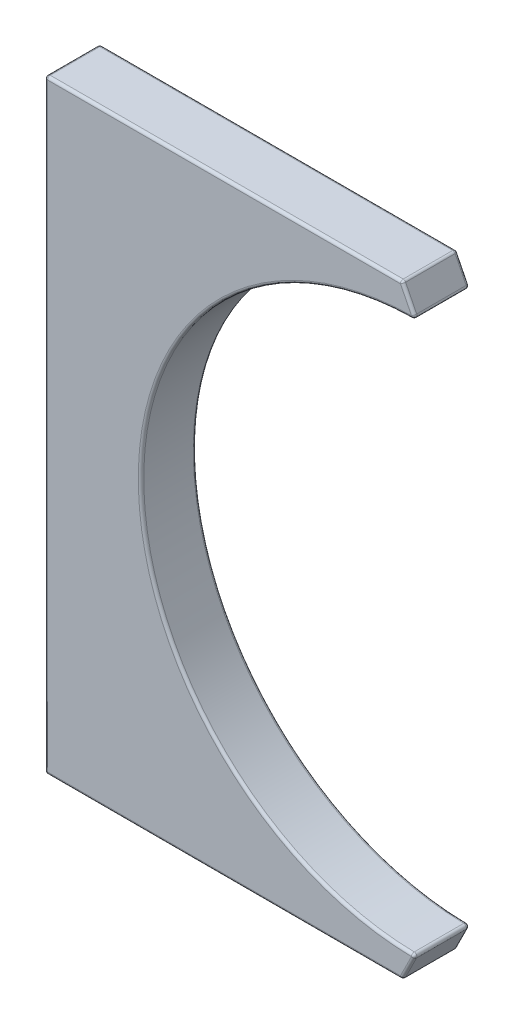
ISO-10303-21;
HEADER;
FILE_DESCRIPTION(('STEP AP214'),'2;1');
FILE_NAME('part.step','',(''),(''),'','','');
FILE_SCHEMA(('AUTOMOTIVE_DESIGN { 1 0 10303 214 1 1 1 1 }'));
ENDSEC;
DATA;
#1=APPLICATION_CONTEXT('core data for automotive mechanical design processes');
#2=APPLICATION_PROTOCOL_DEFINITION('international standard','automotive_design',2000,#1);
#3=PRODUCT_CONTEXT('',#1,'mechanical');
#4=PRODUCT('Part','Part','',(#3));
#5=PRODUCT_RELATED_PRODUCT_CATEGORY('part','',(#4));
#6=PRODUCT_DEFINITION_FORMATION('','',#4);
#7=PRODUCT_DEFINITION_CONTEXT('part definition',#1,'design');
#8=PRODUCT_DEFINITION('design','',#6,#7);
#9=PRODUCT_DEFINITION_SHAPE('','',#8);
#10=(LENGTH_UNIT() NAMED_UNIT(*) SI_UNIT(.MILLI.,.METRE.));
#11=(NAMED_UNIT(*) PLANE_ANGLE_UNIT() SI_UNIT($,.RADIAN.));
#12=(NAMED_UNIT(*) SI_UNIT($,.STERADIAN.) SOLID_ANGLE_UNIT());
#13=UNCERTAINTY_MEASURE_WITH_UNIT(LENGTH_MEASURE(1.E-05),#10,'distance_accuracy_value','');
#14=(GEOMETRIC_REPRESENTATION_CONTEXT(3) GLOBAL_UNCERTAINTY_ASSIGNED_CONTEXT((#13)) GLOBAL_UNIT_ASSIGNED_CONTEXT((#10,
#11,#12)) REPRESENTATION_CONTEXT('',''));
#15=CARTESIAN_POINT('',(0.,0.,0.));
#16=DIRECTION('',(0.,0.,1.));
#17=DIRECTION('',(1.,0.,0.));
#18=AXIS2_PLACEMENT_3D('',#15,#16,#17);
#19=CARTESIAN_POINT('',(0.,105.351887555812,20.));
#20=DIRECTION('',(0.,-1.,0.));
#21=DIRECTION('',(0.,0.,-1.));
#22=AXIS2_PLACEMENT_3D('',#19,#20,#21);
#23=PLANE('',#22);
#24=DIRECTION('',(-1.,0.,0.));
#25=VECTOR('',#24,1.);
#26=CARTESIAN_POINT('',(130.,105.351887555812,19.));
#27=LINE('',#26,#25);
#28=CARTESIAN_POINT('',(1.00000000000003,105.351887555812,19.));
#29=VERTEX_POINT('',#28);
#30=CARTESIAN_POINT('',(129.38196601125,105.351887555812,19.));
#31=VERTEX_POINT('',#30);
#32=EDGE_CURVE('E50',#29,#31,#27,.F.);
#33=ORIENTED_EDGE('',*,*,#32,.T.);
#34=DIRECTION('',(0.,0.,-1.));
#35=VECTOR('',#34,1.);
#36=CARTESIAN_POINT('',(129.38196601125,105.351887555812,20.));
#37=LINE('',#36,#35);
#38=CARTESIAN_POINT('',(129.38196601125,105.351887555812,1.));
#39=VERTEX_POINT('',#38);
#40=EDGE_CURVE('E11',#31,#39,#37,.T.);
#41=ORIENTED_EDGE('',*,*,#40,.T.);
#42=DIRECTION('',(-1.,0.,0.));
#43=VECTOR('',#42,1.);
#44=CARTESIAN_POINT('',(0.,105.351887555812,1.));
#45=LINE('',#44,#43);
#46=CARTESIAN_POINT('',(1.00000000000003,105.351887555812,1.));
#47=VERTEX_POINT('',#46);
#48=EDGE_CURVE('E269',#39,#47,#45,.T.);
#49=ORIENTED_EDGE('',*,*,#48,.T.);
#50=DIRECTION('',(0.,0.,-1.));
#51=VECTOR('',#50,1.);
#52=CARTESIAN_POINT('',(1.00000000000003,105.351887555812,20.));
#53=LINE('',#52,#51);
#54=EDGE_CURVE('E61',#47,#29,#53,.F.);
#55=ORIENTED_EDGE('',*,*,#54,.T.);
#56=EDGE_LOOP('',(#33,#41,#49,#55));
#57=FACE_BOUND('',#56,.T.);
#58=ADVANCED_FACE('F41',(#57),#23,.F.);
#59=CARTESIAN_POINT('',(0.,105.351887555812,20.));
#60=DIRECTION('',(1.,0.,0.));
#61=DIRECTION('',(0.,0.,-1.));
#62=AXIS2_PLACEMENT_3D('',#59,#60,#61);
#63=PLANE('',#62);
#64=DIRECTION('',(0.,-1.,0.));
#65=VECTOR('',#64,1.);
#66=CARTESIAN_POINT('',(0.,105.351887555812,1.));
#67=LINE('',#66,#65);
#68=CARTESIAN_POINT('',(0.,104.351887555812,1.));
#69=VERTEX_POINT('',#68);
#70=CARTESIAN_POINT('',(0.,-113.648112444188,1.));
#71=VERTEX_POINT('',#70);
#72=EDGE_CURVE('E213',#69,#71,#67,.T.);
#73=ORIENTED_EDGE('',*,*,#72,.T.);
#74=DIRECTION('',(0.,0.,-1.));
#75=VECTOR('',#74,1.);
#76=CARTESIAN_POINT('',(0.,-113.648112444188,20.));
#77=LINE('',#76,#75);
#78=CARTESIAN_POINT('',(0.,-113.648112444188,19.));
#79=VERTEX_POINT('',#78);
#80=EDGE_CURVE('E215',#71,#79,#77,.F.);
#81=ORIENTED_EDGE('',*,*,#80,.T.);
#82=DIRECTION('',(0.,-1.,0.));
#83=VECTOR('',#82,1.);
#84=CARTESIAN_POINT('',(0.,105.351887555812,19.));
#85=LINE('',#84,#83);
#86=CARTESIAN_POINT('',(0.,104.351887555812,19.));
#87=VERTEX_POINT('',#86);
#88=EDGE_CURVE('E211',#79,#87,#85,.F.);
#89=ORIENTED_EDGE('',*,*,#88,.T.);
#90=DIRECTION('',(0.,0.,-1.));
#91=VECTOR('',#90,1.);
#92=CARTESIAN_POINT('',(0.,104.351887555812,20.));
#93=LINE('',#92,#91);
#94=EDGE_CURVE('E209',#87,#69,#93,.T.);
#95=ORIENTED_EDGE('',*,*,#94,.T.);
#96=EDGE_LOOP('',(#73,#81,#89,#95));
#97=FACE_BOUND('',#96,.T.);
#98=ADVANCED_FACE('F466',(#97),#63,.F.);
#99=CARTESIAN_POINT('',(0.,-114.648112444188,20.));
#100=DIRECTION('',(0.,1.,0.));
#101=DIRECTION('',(0.,0.,1.));
#102=AXIS2_PLACEMENT_3D('',#99,#100,#101);
#103=PLANE('',#102);
#104=DIRECTION('',(0.,0.,-1.));
#105=VECTOR('',#104,1.);
#106=CARTESIAN_POINT('',(1.00000000000003,-114.648112444188,20.));
#107=LINE('',#106,#105);
#108=CARTESIAN_POINT('',(1.00000000000003,-114.648112444188,19.));
#109=VERTEX_POINT('',#108);
#110=CARTESIAN_POINT('',(1.00000000000003,-114.648112444188,1.));
#111=VERTEX_POINT('',#110);
#112=EDGE_CURVE('E176',#109,#111,#107,.T.);
#113=ORIENTED_EDGE('',*,*,#112,.T.);
#114=DIRECTION('',(1.,0.,0.));
#115=VECTOR('',#114,1.);
#116=CARTESIAN_POINT('',(0.,-114.648112444188,1.));
#117=LINE('',#116,#115);
#118=CARTESIAN_POINT('',(129.38196601125,-114.648112444188,1.));
#119=VERTEX_POINT('',#118);
#120=EDGE_CURVE('E172',#111,#119,#117,.T.);
#121=ORIENTED_EDGE('',*,*,#120,.T.);
#122=DIRECTION('',(0.,0.,-1.));
#123=VECTOR('',#122,1.);
#124=CARTESIAN_POINT('',(129.38196601125,-114.648112444188,20.));
#125=LINE('',#124,#123);
#126=CARTESIAN_POINT('',(129.38196601125,-114.648112444188,19.));
#127=VERTEX_POINT('',#126);
#128=EDGE_CURVE('E164',#119,#127,#125,.F.);
#129=ORIENTED_EDGE('',*,*,#128,.T.);
#130=DIRECTION('',(1.,0.,0.));
#131=VECTOR('',#130,1.);
#132=CARTESIAN_POINT('',(0.,-114.648112444188,19.));
#133=LINE('',#132,#131);
#134=EDGE_CURVE('E169',#127,#109,#133,.F.);
#135=ORIENTED_EDGE('',*,*,#134,.T.);
#136=EDGE_LOOP('',(#113,#121,#129,#135));
#137=FACE_BOUND('',#136,.T.);
#138=ADVANCED_FACE('F167',(#137),#103,.F.);
#139=CARTESIAN_POINT('',(130.,-114.648112444188,20.));
#140=DIRECTION('',(-0.894427190999916,0.447213595499958,0.));
#141=DIRECTION('',(-0.447213595499958,-0.894427190999916,0.));
#142=AXIS2_PLACEMENT_3D('',#139,#140,#141);
#143=PLANE('',#142);
#144=DIRECTION('',(0.447213595499958,0.894427190999916,0.));
#145=VECTOR('',#144,1.);
#146=CARTESIAN_POINT('',(130.,-114.648112444188,19.));
#147=LINE('',#146,#145);
#148=CARTESIAN_POINT('',(134.282822496887,-106.082467450413,19.));
#149=VERTEX_POINT('',#148);
#150=CARTESIAN_POINT('',(130.27639320225,-114.095326039688,19.));
#151=VERTEX_POINT('',#150);
#152=EDGE_CURVE('E218',#149,#151,#147,.F.);
#153=ORIENTED_EDGE('',*,*,#152,.T.);
#154=DIRECTION('',(0.,0.,-1.));
#155=VECTOR('',#154,1.);
#156=CARTESIAN_POINT('',(130.27639320225,-114.095326039688,20.));
#157=LINE('',#156,#155);
#158=CARTESIAN_POINT('',(130.27639320225,-114.095326039688,1.));
#159=VERTEX_POINT('',#158);
#160=EDGE_CURVE('E184',#151,#159,#157,.T.);
#161=ORIENTED_EDGE('',*,*,#160,.T.);
#162=DIRECTION('',(0.447213595499958,0.894427190999916,0.));
#163=VECTOR('',#162,1.);
#164=CARTESIAN_POINT('',(130.,-114.648112444188,1.));
#165=LINE('',#164,#163);
#166=CARTESIAN_POINT('',(134.282822496887,-106.082467450413,1.));
#167=VERTEX_POINT('',#166);
#168=EDGE_CURVE('E222',#159,#167,#165,.T.);
#169=ORIENTED_EDGE('',*,*,#168,.T.);
#170=DIRECTION('',(0.,0.,-1.));
#171=VECTOR('',#170,1.);
#172=CARTESIAN_POINT('',(134.282822496887,-106.082467450413,20.));
#173=LINE('',#172,#171);
#174=EDGE_CURVE('E220',#167,#149,#173,.F.);
#175=ORIENTED_EDGE('',*,*,#174,.T.);
#176=EDGE_LOOP('',(#153,#161,#169,#175));
#177=FACE_BOUND('',#176,.T.);
#178=ADVANCED_FACE('F732',(#177),#143,.F.);
#179=CARTESIAN_POINT('',(135.,-4.64811244418777,20.));
#180=DIRECTION('',(0.,0.,-1.));
#181=DIRECTION('',(-1.,0.,0.));
#182=AXIS2_PLACEMENT_3D('',#179,#180,#181);
#183=CYLINDRICAL_SURFACE('',#182,100.);
#184=DIRECTION('',(0.,0.,-1.));
#185=VECTOR('',#184,1.);
#186=CARTESIAN_POINT('',(133.404351788007,-104.635381167679,20.));
#187=LINE('',#186,#185);
#188=CARTESIAN_POINT('',(133.404351788007,-104.635381167679,19.));
#189=VERTEX_POINT('',#188);
#190=CARTESIAN_POINT('',(133.404351788007,-104.635381167679,1.));
#191=VERTEX_POINT('',#190);
#192=EDGE_CURVE('E251',#189,#191,#187,.T.);
#193=ORIENTED_EDGE('',*,*,#192,.T.);
#194=CARTESIAN_POINT('',(135.,-4.64811244418777,1.));
#195=DIRECTION('',(0.,0.,1.));
#196=DIRECTION('',(1.,0.,0.));
#197=AXIS2_PLACEMENT_3D('',#194,#195,#196);
#198=CIRCLE('',#197,100.);
#199=CARTESIAN_POINT('',(133.404351788007,95.339156279303,1.));
#200=VERTEX_POINT('',#199);
#201=EDGE_CURVE('E254',#191,#200,#198,.F.);
#202=ORIENTED_EDGE('',*,*,#201,.T.);
#203=DIRECTION('',(0.,0.,-1.));
#204=VECTOR('',#203,1.);
#205=CARTESIAN_POINT('',(133.404351788007,95.339156279303,20.));
#206=LINE('',#205,#204);
#207=CARTESIAN_POINT('',(133.404351788007,95.339156279303,19.));
#208=VERTEX_POINT('',#207);
#209=EDGE_CURVE('E249',#200,#208,#206,.F.);
#210=ORIENTED_EDGE('',*,*,#209,.T.);
#211=CARTESIAN_POINT('',(135.,-4.64811244418777,19.));
#212=DIRECTION('',(0.,0.,1.));
#213=DIRECTION('',(1.,0.,0.));
#214=AXIS2_PLACEMENT_3D('',#211,#212,#213);
#215=CIRCLE('',#214,100.);
#216=EDGE_CURVE('E247',#208,#189,#215,.T.);
#217=ORIENTED_EDGE('',*,*,#216,.T.);
#218=EDGE_LOOP('',(#193,#202,#210,#217));
#219=FACE_BOUND('',#218,.T.);
#220=ADVANCED_FACE('F404',(#219),#183,.F.);
#221=CARTESIAN_POINT('',(130.,105.351887555812,20.));
#222=DIRECTION('',(-0.894427190999916,-0.447213595499958,0.));
#223=DIRECTION('',(0.447213595499958,-0.894427190999916,0.));
#224=AXIS2_PLACEMENT_3D('',#221,#222,#223);
#225=PLANE('',#224);
#226=DIRECTION('',(0.,0.,-1.));
#227=VECTOR('',#226,1.);
#228=CARTESIAN_POINT('',(134.282822496887,96.7862425620379,20.));
#229=LINE('',#228,#227);
#230=CARTESIAN_POINT('',(134.282822496887,96.7862425620379,19.));
#231=VERTEX_POINT('',#230);
#232=CARTESIAN_POINT('',(134.282822496887,96.7862425620379,1.));
#233=VERTEX_POINT('',#232);
#234=EDGE_CURVE('E242',#231,#233,#229,.T.);
#235=ORIENTED_EDGE('',*,*,#234,.T.);
#236=DIRECTION('',(-0.447213595499958,0.894427190999916,0.));
#237=VECTOR('',#236,1.);
#238=CARTESIAN_POINT('',(130.,105.351887555812,1.));
#239=LINE('',#238,#237);
#240=CARTESIAN_POINT('',(130.27639320225,104.799101151312,1.));
#241=VERTEX_POINT('',#240);
#242=EDGE_CURVE('E244',#233,#241,#239,.T.);
#243=ORIENTED_EDGE('',*,*,#242,.T.);
#244=DIRECTION('',(0.,0.,-1.));
#245=VECTOR('',#244,1.);
#246=CARTESIAN_POINT('',(130.27639320225,104.799101151312,20.));
#247=LINE('',#246,#245);
#248=CARTESIAN_POINT('',(130.27639320225,104.799101151312,19.));
#249=VERTEX_POINT('',#248);
#250=EDGE_CURVE('E238',#241,#249,#247,.F.);
#251=ORIENTED_EDGE('',*,*,#250,.T.);
#252=DIRECTION('',(-0.447213595499958,0.894427190999916,0.));
#253=VECTOR('',#252,1.);
#254=CARTESIAN_POINT('',(135.,95.3518875558122,19.));
#255=LINE('',#254,#253);
#256=EDGE_CURVE('E240',#249,#231,#255,.F.);
#257=ORIENTED_EDGE('',*,*,#256,.T.);
#258=EDGE_LOOP('',(#235,#243,#251,#257));
#259=FACE_BOUND('',#258,.T.);
#260=ADVANCED_FACE('F381',(#259),#225,.F.);
#261=CARTESIAN_POINT('',(135.,-4.64811244418777,20.));
#262=DIRECTION('',(0.,0.,1.));
#263=DIRECTION('',(1.,0.,0.));
#264=AXIS2_PLACEMENT_3D('',#261,#262,#263);
#265=PLANE('',#264);
#266=CARTESIAN_POINT('',(135.,-4.64811244418777,20.));
#267=DIRECTION('',(0.,0.,1.));
#268=DIRECTION('',(1.,0.,0.));
#269=AXIS2_PLACEMENT_3D('',#266,#267,#268);
#270=CIRCLE('',#269,101.);
#271=CARTESIAN_POINT('',(133.388395305887,-105.635253854914,20.));
#272=VERTEX_POINT('',#271);
#273=CARTESIAN_POINT('',(133.388395305887,96.339028966538,20.));
#274=VERTEX_POINT('',#273);
#275=EDGE_CURVE('E264',#272,#274,#270,.F.);
#276=ORIENTED_EDGE('',*,*,#275,.T.);
#277=DIRECTION('',(-0.447213595499958,0.894427190999916,0.));
#278=VECTOR('',#277,1.);
#279=CARTESIAN_POINT('',(129.105572809,104.904673960312,20.));
#280=LINE('',#279,#278);
#281=CARTESIAN_POINT('',(129.38196601125,104.351887555812,20.));
#282=VERTEX_POINT('',#281);
#283=EDGE_CURVE('E266',#274,#282,#280,.T.);
#284=ORIENTED_EDGE('',*,*,#283,.T.);
#285=DIRECTION('',(-1.,0.,0.));
#286=VECTOR('',#285,1.);
#287=CARTESIAN_POINT('',(0.,104.351887555812,20.));
#288=LINE('',#287,#286);
#289=CARTESIAN_POINT('',(1.00000000000003,104.351887555812,20.));
#290=VERTEX_POINT('',#289);
#291=EDGE_CURVE('E256',#282,#290,#288,.T.);
#292=ORIENTED_EDGE('',*,*,#291,.T.);
#293=DIRECTION('',(0.,-1.,0.));
#294=VECTOR('',#293,1.);
#295=CARTESIAN_POINT('',(1.00000000000003,-114.648112444188,20.));
#296=LINE('',#295,#294);
#297=CARTESIAN_POINT('',(1.00000000000003,-113.648112444188,20.));
#298=VERTEX_POINT('',#297);
#299=EDGE_CURVE('E258',#290,#298,#296,.T.);
#300=ORIENTED_EDGE('',*,*,#299,.T.);
#301=DIRECTION('',(1.,0.,0.));
#302=VECTOR('',#301,1.);
#303=CARTESIAN_POINT('',(130.,-113.648112444188,20.));
#304=LINE('',#303,#302);
#305=CARTESIAN_POINT('',(129.38196601125,-113.648112444188,20.));
#306=VERTEX_POINT('',#305);
#307=EDGE_CURVE('E260',#298,#306,#304,.T.);
#308=ORIENTED_EDGE('',*,*,#307,.T.);
#309=DIRECTION('',(0.447213595499958,0.894427190999916,0.));
#310=VECTOR('',#309,1.);
#311=CARTESIAN_POINT('',(134.105572809,-104.200898848688,20.));
#312=LINE('',#311,#310);
#313=EDGE_CURVE('E262',#306,#272,#312,.T.);
#314=ORIENTED_EDGE('',*,*,#313,.T.);
#315=EDGE_LOOP('',(#276,#284,#292,#300,#308,#314));
#316=FACE_BOUND('',#315,.T.);
#317=ADVANCED_FACE('F395',(#316),#265,.T.);
#318=CARTESIAN_POINT('',(135.,-4.64811244418777,0.));
#319=DIRECTION('',(0.,0.,1.));
#320=DIRECTION('',(1.,0.,0.));
#321=AXIS2_PLACEMENT_3D('',#318,#319,#320);
#322=PLANE('',#321);
#323=DIRECTION('',(0.447213595499958,0.894427190999916,0.));
#324=VECTOR('',#323,1.);
#325=CARTESIAN_POINT('',(174.105572809,-24.2008988486878,0.));
#326=LINE('',#325,#324);
#327=CARTESIAN_POINT('',(133.388395305887,-105.635253854914,0.));
#328=VERTEX_POINT('',#327);
#329=CARTESIAN_POINT('',(129.38196601125,-113.648112444188,0.));
#330=VERTEX_POINT('',#329);
#331=EDGE_CURVE('E234',#328,#330,#326,.F.);
#332=ORIENTED_EDGE('',*,*,#331,.T.);
#333=DIRECTION('',(1.,0.,0.));
#334=VECTOR('',#333,1.);
#335=CARTESIAN_POINT('',(135.,-113.648112444188,0.));
#336=LINE('',#335,#334);
#337=CARTESIAN_POINT('',(1.00000000000003,-113.648112444188,0.));
#338=VERTEX_POINT('',#337);
#339=EDGE_CURVE('E236',#330,#338,#336,.F.);
#340=ORIENTED_EDGE('',*,*,#339,.T.);
#341=DIRECTION('',(0.,-1.,0.));
#342=VECTOR('',#341,1.);
#343=CARTESIAN_POINT('',(1.00000000000003,-4.64811244418777,0.));
#344=LINE('',#343,#342);
#345=CARTESIAN_POINT('',(1.00000000000003,104.351887555812,0.));
#346=VERTEX_POINT('',#345);
#347=EDGE_CURVE('E229',#338,#346,#344,.F.);
#348=ORIENTED_EDGE('',*,*,#347,.T.);
#349=DIRECTION('',(-1.,0.,0.));
#350=VECTOR('',#349,1.);
#351=CARTESIAN_POINT('',(135.,104.351887555812,0.));
#352=LINE('',#351,#350);
#353=CARTESIAN_POINT('',(129.38196601125,104.351887555812,0.));
#354=VERTEX_POINT('',#353);
#355=EDGE_CURVE('E225',#346,#354,#352,.F.);
#356=ORIENTED_EDGE('',*,*,#355,.T.);
#357=DIRECTION('',(-0.447213595499958,0.894427190999916,0.));
#358=VECTOR('',#357,1.);
#359=CARTESIAN_POINT('',(174.105572809,14.9046739603123,0.));
#360=LINE('',#359,#358);
#361=CARTESIAN_POINT('',(133.388395305887,96.339028966538,0.));
#362=VERTEX_POINT('',#361);
#363=EDGE_CURVE('E227',#354,#362,#360,.F.);
#364=ORIENTED_EDGE('',*,*,#363,.T.);
#365=CARTESIAN_POINT('',(135.,-4.64811244418777,0.));
#366=DIRECTION('',(0.,0.,1.));
#367=DIRECTION('',(1.,0.,0.));
#368=AXIS2_PLACEMENT_3D('',#365,#366,#367);
#369=CIRCLE('',#368,101.);
#370=EDGE_CURVE('E232',#362,#328,#369,.T.);
#371=ORIENTED_EDGE('',*,*,#370,.T.);
#372=EDGE_LOOP('',(#332,#340,#348,#356,#364,#371));
#373=FACE_BOUND('',#372,.T.);
#374=ADVANCED_FACE('F371',(#373),#322,.F.);
#375=CARTESIAN_POINT('',(133.388395305887,96.339028966538,20.));
#376=DIRECTION('',(0.,0.,-1.));
#377=DIRECTION('',(-1.,0.,0.));
#378=AXIS2_PLACEMENT_3D('',#375,#376,#377);
#379=CYLINDRICAL_SURFACE('',#378,1.);
#380=CARTESIAN_POINT('',(133.388395305887,96.339028966538,19.));
#381=DIRECTION('',(0.,0.,1.));
#382=DIRECTION('',(1.,0.,0.));
#383=AXIS2_PLACEMENT_3D('',#380,#381,#382);
#384=CIRCLE('',#383,1.);
#385=EDGE_CURVE('E45',#208,#231,#384,.T.);
#386=ORIENTED_EDGE('',*,*,#385,.F.);
#387=ORIENTED_EDGE('',*,*,#209,.F.);
#388=CARTESIAN_POINT('',(133.388395305887,96.339028966538,1.));
#389=DIRECTION('',(0.,0.,-1.));
#390=DIRECTION('',(-1.,0.,0.));
#391=AXIS2_PLACEMENT_3D('',#388,#389,#390);
#392=CIRCLE('',#391,1.);
#393=EDGE_CURVE('E205',#233,#200,#392,.T.);
#394=ORIENTED_EDGE('',*,*,#393,.F.);
#395=ORIENTED_EDGE('',*,*,#234,.F.);
#396=EDGE_LOOP('',(#386,#387,#394,#395));
#397=FACE_BOUND('',#396,.T.);
#398=ADVANCED_FACE('F43',(#397),#379,.T.);
#399=CARTESIAN_POINT('',(133.388395305887,96.339028966538,19.));
#400=DIRECTION('',(0.,0.,1.));
#401=DIRECTION('',(1.,0.,0.));
#402=AXIS2_PLACEMENT_3D('',#399,#400,#401);
#403=SPHERICAL_SURFACE('',#402,1.);
#404=CARTESIAN_POINT('',(133.388395305887,96.339028966538,19.));
#405=DIRECTION('',(0.999872687234908,0.0159564821199385,0.));
#406=DIRECTION('',(-0.0159564821199385,0.999872687234908,0.));
#407=AXIS2_PLACEMENT_3D('',#404,#405,#406);
#408=CIRCLE('',#407,1.);
#409=EDGE_CURVE('E349',#208,#274,#408,.F.);
#410=ORIENTED_EDGE('',*,*,#409,.F.);
#411=ORIENTED_EDGE('',*,*,#385,.T.);
#412=CARTESIAN_POINT('',(133.388395305887,96.339028966538,19.));
#413=DIRECTION('',(0.447213595499958,-0.894427190999916,0.));
#414=DIRECTION('',(0.894427190999916,0.447213595499958,0.));
#415=AXIS2_PLACEMENT_3D('',#412,#413,#414);
#416=CIRCLE('',#415,1.);
#417=EDGE_CURVE('E352',#274,#231,#416,.F.);
#418=ORIENTED_EDGE('',*,*,#417,.F.);
#419=EDGE_LOOP('',(#410,#411,#418));
#420=FACE_BOUND('',#419,.T.);
#421=ADVANCED_FACE('F387',(#420),#403,.T.);
#422=CARTESIAN_POINT('',(133.388395305887,96.339028966538,1.));
#423=DIRECTION('',(0.,0.,-1.));
#424=DIRECTION('',(0.,1.,0.));
#425=AXIS2_PLACEMENT_3D('',#422,#423,#424);
#426=SPHERICAL_SURFACE('',#425,1.);
#427=CARTESIAN_POINT('',(133.388395305887,96.339028966538,1.));
#428=DIRECTION('',(0.447213595499958,-0.894427190999916,0.));
#429=DIRECTION('',(0.894427190999916,0.447213595499958,0.));
#430=AXIS2_PLACEMENT_3D('',#427,#428,#429);
#431=CIRCLE('',#430,1.);
#432=EDGE_CURVE('E343',#233,#362,#431,.F.);
#433=ORIENTED_EDGE('',*,*,#432,.F.);
#434=ORIENTED_EDGE('',*,*,#393,.T.);
#435=CARTESIAN_POINT('',(133.388395305887,96.339028966538,1.));
#436=DIRECTION('',(0.999872687234908,0.0159564821199387,0.));
#437=DIRECTION('',(-0.0159564821199387,0.999872687234908,0.));
#438=AXIS2_PLACEMENT_3D('',#435,#436,#437);
#439=CIRCLE('',#438,1.);
#440=EDGE_CURVE('E346',#362,#200,#439,.F.);
#441=ORIENTED_EDGE('',*,*,#440,.F.);
#442=EDGE_LOOP('',(#433,#434,#441));
#443=FACE_BOUND('',#442,.T.);
#444=ADVANCED_FACE('F359',(#443),#426,.T.);
#445=CARTESIAN_POINT('',(174.105572809,14.9046739603123,19.));
#446=DIRECTION('',(0.447213595499958,-0.894427190999916,0.));
#447=DIRECTION('',(0.894427190999916,0.447213595499958,0.));
#448=AXIS2_PLACEMENT_3D('',#445,#446,#447);
#449=CYLINDRICAL_SURFACE('',#448,1.);
#450=ORIENTED_EDGE('',*,*,#417,.T.);
#451=ORIENTED_EDGE('',*,*,#256,.F.);
#452=CARTESIAN_POINT('',(129.38196601125,104.351887555812,19.));
#453=DIRECTION('',(-0.447213595499958,0.894427190999916,0.));
#454=DIRECTION('',(-0.894427190999916,-0.447213595499958,0.));
#455=AXIS2_PLACEMENT_3D('',#452,#453,#454);
#456=CIRCLE('',#455,1.);
#457=EDGE_CURVE('E337',#282,#249,#456,.T.);
#458=ORIENTED_EDGE('',*,*,#457,.F.);
#459=ORIENTED_EDGE('',*,*,#283,.F.);
#460=EDGE_LOOP('',(#450,#451,#458,#459));
#461=FACE_BOUND('',#460,.T.);
#462=ADVANCED_FACE('F391',(#461),#449,.T.);
#463=CARTESIAN_POINT('',(135.,-4.64811244418777,19.));
#464=DIRECTION('',(0.,0.,1.));
#465=DIRECTION('',(1.,0.,0.));
#466=AXIS2_PLACEMENT_3D('',#463,#464,#465);
#467=TOROIDAL_SURFACE('',#466,101.,1.);
#468=ORIENTED_EDGE('',*,*,#409,.T.);
#469=ORIENTED_EDGE('',*,*,#275,.F.);
#470=CARTESIAN_POINT('',(133.388395305887,-105.635253854913,19.));
#471=DIRECTION('',(0.999872687234908,-0.0159564821199387,0.));
#472=DIRECTION('',(0.0159564821199387,0.999872687234908,0.));
#473=AXIS2_PLACEMENT_3D('',#470,#471,#472);
#474=CIRCLE('',#473,1.);
#475=EDGE_CURVE('E334',#189,#272,#474,.T.);
#476=ORIENTED_EDGE('',*,*,#475,.F.);
#477=ORIENTED_EDGE('',*,*,#216,.F.);
#478=EDGE_LOOP('',(#468,#469,#476,#477));
#479=FACE_BOUND('',#478,.T.);
#480=ADVANCED_FACE('F401',(#479),#467,.T.);
#481=CARTESIAN_POINT('',(133.388395305887,-105.635253854914,20.));
#482=DIRECTION('',(0.,0.,-1.));
#483=DIRECTION('',(-1.,0.,0.));
#484=AXIS2_PLACEMENT_3D('',#481,#482,#483);
#485=CYLINDRICAL_SURFACE('',#484,1.);
#486=CARTESIAN_POINT('',(133.388395305887,-105.635253854913,1.));
#487=DIRECTION('',(0.,0.,-1.));
#488=DIRECTION('',(-1.,0.,0.));
#489=AXIS2_PLACEMENT_3D('',#486,#487,#488);
#490=CIRCLE('',#489,1.);
#491=EDGE_CURVE('E328',#191,#167,#490,.T.);
#492=ORIENTED_EDGE('',*,*,#491,.F.);
#493=ORIENTED_EDGE('',*,*,#192,.F.);
#494=CARTESIAN_POINT('',(133.388395305887,-105.635253854914,19.));
#495=DIRECTION('',(0.,0.,1.));
#496=DIRECTION('',(1.,0.,0.));
#497=AXIS2_PLACEMENT_3D('',#494,#495,#496);
#498=CIRCLE('',#497,1.);
#499=EDGE_CURVE('E331',#149,#189,#498,.T.);
#500=ORIENTED_EDGE('',*,*,#499,.F.);
#501=ORIENTED_EDGE('',*,*,#174,.F.);
#502=EDGE_LOOP('',(#492,#493,#500,#501));
#503=FACE_BOUND('',#502,.T.);
#504=ADVANCED_FACE('F408',(#503),#485,.T.);
#505=CARTESIAN_POINT('',(135.,-4.64811244418777,1.));
#506=DIRECTION('',(0.,0.,1.));
#507=DIRECTION('',(1.,0.,0.));
#508=AXIS2_PLACEMENT_3D('',#505,#506,#507);
#509=TOROIDAL_SURFACE('',#508,101.,1.);
#510=ORIENTED_EDGE('',*,*,#440,.T.);
#511=ORIENTED_EDGE('',*,*,#201,.F.);
#512=CARTESIAN_POINT('',(133.388395305887,-105.635253854914,1.));
#513=DIRECTION('',(0.999872687234908,-0.0159564821199385,0.));
#514=DIRECTION('',(0.0159564821199385,0.999872687234908,0.));
#515=AXIS2_PLACEMENT_3D('',#512,#513,#514);
#516=CIRCLE('',#515,1.);
#517=EDGE_CURVE('E326',#328,#191,#516,.T.);
#518=ORIENTED_EDGE('',*,*,#517,.F.);
#519=ORIENTED_EDGE('',*,*,#370,.F.);
#520=EDGE_LOOP('',(#510,#511,#518,#519));
#521=FACE_BOUND('',#520,.T.);
#522=ADVANCED_FACE('F367',(#521),#509,.T.);
#523=CARTESIAN_POINT('',(129.105572809,104.904673960312,1.));
#524=DIRECTION('',(-0.447213595499958,0.894427190999916,0.));
#525=DIRECTION('',(-0.894427190999916,-0.447213595499958,0.));
#526=AXIS2_PLACEMENT_3D('',#523,#524,#525);
#527=CYLINDRICAL_SURFACE('',#526,1.);
#528=ORIENTED_EDGE('',*,*,#432,.T.);
#529=ORIENTED_EDGE('',*,*,#363,.F.);
#530=CARTESIAN_POINT('',(129.38196601125,104.351887555812,1.));
#531=DIRECTION('',(-0.447213595499958,0.894427190999916,0.));
#532=DIRECTION('',(-0.894427190999916,-0.447213595499958,0.));
#533=AXIS2_PLACEMENT_3D('',#530,#531,#532);
#534=CIRCLE('',#533,1.);
#535=EDGE_CURVE('E323',#241,#354,#534,.T.);
#536=ORIENTED_EDGE('',*,*,#535,.F.);
#537=ORIENTED_EDGE('',*,*,#242,.F.);
#538=EDGE_LOOP('',(#528,#529,#536,#537));
#539=FACE_BOUND('',#538,.T.);
#540=ADVANCED_FACE('F378',(#539),#527,.T.);
#541=CARTESIAN_POINT('',(129.38196601125,104.351887555812,20.));
#542=DIRECTION('',(0.,0.,-1.));
#543=DIRECTION('',(-1.,0.,0.));
#544=AXIS2_PLACEMENT_3D('',#541,#542,#543);
#545=CYLINDRICAL_SURFACE('',#544,1.);
#546=CARTESIAN_POINT('',(129.38196601125,104.351887555812,19.));
#547=DIRECTION('',(0.,0.,1.));
#548=DIRECTION('',(1.,0.,0.));
#549=AXIS2_PLACEMENT_3D('',#546,#547,#548);
#550=CIRCLE('',#549,1.);
#551=EDGE_CURVE('E340',#249,#31,#550,.T.);
#552=ORIENTED_EDGE('',*,*,#551,.F.);
#553=ORIENTED_EDGE('',*,*,#250,.F.);
#554=CARTESIAN_POINT('',(129.38196601125,104.351887555812,1.));
#555=DIRECTION('',(0.,0.,-1.));
#556=DIRECTION('',(-1.,0.,0.));
#557=AXIS2_PLACEMENT_3D('',#554,#555,#556);
#558=CIRCLE('',#557,1.);
#559=EDGE_CURVE('E321',#39,#241,#558,.T.);
#560=ORIENTED_EDGE('',*,*,#559,.F.);
#561=ORIENTED_EDGE('',*,*,#40,.F.);
#562=EDGE_LOOP('',(#552,#553,#560,#561));
#563=FACE_BOUND('',#562,.T.);
#564=ADVANCED_FACE('F441',(#563),#545,.T.);
#565=CARTESIAN_POINT('',(129.38196601125,104.351887555812,19.));
#566=DIRECTION('',(0.,0.,1.));
#567=DIRECTION('',(1.,0.,0.));
#568=AXIS2_PLACEMENT_3D('',#565,#566,#567);
#569=SPHERICAL_SURFACE('',#568,1.);
#570=ORIENTED_EDGE('',*,*,#457,.T.);
#571=ORIENTED_EDGE('',*,*,#551,.T.);
#572=CARTESIAN_POINT('',(129.38196601125,104.351887555812,19.));
#573=DIRECTION('',(1.,0.,0.));
#574=DIRECTION('',(0.,0.,-1.));
#575=AXIS2_PLACEMENT_3D('',#572,#573,#574);
#576=CIRCLE('',#575,1.);
#577=EDGE_CURVE('E318',#282,#31,#576,.F.);
#578=ORIENTED_EDGE('',*,*,#577,.F.);
#579=EDGE_LOOP('',(#570,#571,#578));
#580=FACE_BOUND('',#579,.T.);
#581=ADVANCED_FACE('F454',(#580),#569,.T.);
#582=CARTESIAN_POINT('',(133.388395305887,-105.635253854914,19.));
#583=DIRECTION('',(0.,0.,1.));
#584=DIRECTION('',(1.,0.,0.));
#585=AXIS2_PLACEMENT_3D('',#582,#583,#584);
#586=SPHERICAL_SURFACE('',#585,1.);
#587=ORIENTED_EDGE('',*,*,#499,.T.);
#588=ORIENTED_EDGE('',*,*,#475,.T.);
#589=CARTESIAN_POINT('',(133.388395305887,-105.635253854914,19.));
#590=DIRECTION('',(0.447213595499958,0.894427190999916,0.));
#591=DIRECTION('',(-0.894427190999916,0.447213595499958,0.));
#592=AXIS2_PLACEMENT_3D('',#589,#590,#591);
#593=CIRCLE('',#592,1.);
#594=EDGE_CURVE('E315',#149,#272,#593,.F.);
#595=ORIENTED_EDGE('',*,*,#594,.F.);
#596=EDGE_LOOP('',(#587,#588,#595));
#597=FACE_BOUND('',#596,.T.);
#598=ADVANCED_FACE('F456',(#597),#586,.T.);
#599=CARTESIAN_POINT('',(133.388395305887,-105.635253854914,1.));
#600=DIRECTION('',(0.,0.,-1.));
#601=DIRECTION('',(-1.,0.,0.));
#602=AXIS2_PLACEMENT_3D('',#599,#600,#601);
#603=SPHERICAL_SURFACE('',#602,1.);
#604=ORIENTED_EDGE('',*,*,#517,.T.);
#605=ORIENTED_EDGE('',*,*,#491,.T.);
#606=CARTESIAN_POINT('',(133.388395305887,-105.635253854914,1.));
#607=DIRECTION('',(0.447213595499958,0.894427190999916,0.));
#608=DIRECTION('',(-0.894427190999916,0.447213595499958,0.));
#609=AXIS2_PLACEMENT_3D('',#606,#607,#608);
#610=CIRCLE('',#609,1.);
#611=EDGE_CURVE('E312',#328,#167,#610,.F.);
#612=ORIENTED_EDGE('',*,*,#611,.F.);
#613=EDGE_LOOP('',(#604,#605,#612));
#614=FACE_BOUND('',#613,.T.);
#615=ADVANCED_FACE('F412',(#614),#603,.T.);
#616=CARTESIAN_POINT('',(129.38196601125,104.351887555812,1.));
#617=DIRECTION('',(0.,0.,-1.));
#618=DIRECTION('',(-1.,0.,0.));
#619=AXIS2_PLACEMENT_3D('',#616,#617,#618);
#620=SPHERICAL_SURFACE('',#619,1.);
#621=ORIENTED_EDGE('',*,*,#559,.T.);
#622=ORIENTED_EDGE('',*,*,#535,.T.);
#623=CARTESIAN_POINT('',(129.38196601125,104.351887555812,1.));
#624=DIRECTION('',(1.,0.,0.));
#625=DIRECTION('',(0.,0.,-1.));
#626=AXIS2_PLACEMENT_3D('',#623,#624,#625);
#627=CIRCLE('',#626,1.);
#628=EDGE_CURVE('E309',#39,#354,#627,.F.);
#629=ORIENTED_EDGE('',*,*,#628,.F.);
#630=EDGE_LOOP('',(#621,#622,#629));
#631=FACE_BOUND('',#630,.T.);
#632=ADVANCED_FACE('F439',(#631),#620,.T.);
#633=CARTESIAN_POINT('',(135.,104.351887555812,19.));
#634=DIRECTION('',(1.,0.,0.));
#635=DIRECTION('',(0.,0.,-1.));
#636=AXIS2_PLACEMENT_3D('',#633,#634,#635);
#637=CYLINDRICAL_SURFACE('',#636,1.);
#638=ORIENTED_EDGE('',*,*,#577,.T.);
#639=ORIENTED_EDGE('',*,*,#32,.F.);
#640=CARTESIAN_POINT('',(1.00000000000003,104.351887555812,19.));
#641=DIRECTION('',(-1.,0.,0.));
#642=DIRECTION('',(0.,-1.,0.));
#643=AXIS2_PLACEMENT_3D('',#640,#641,#642);
#644=CIRCLE('',#643,1.);
#645=EDGE_CURVE('E303',#290,#29,#644,.T.);
#646=ORIENTED_EDGE('',*,*,#645,.F.);
#647=ORIENTED_EDGE('',*,*,#291,.F.);
#648=EDGE_LOOP('',(#638,#639,#646,#647));
#649=FACE_BOUND('',#648,.T.);
#650=ADVANCED_FACE('F451',(#649),#637,.T.);
#651=CARTESIAN_POINT('',(174.105572809,-24.2008988486878,19.));
#652=DIRECTION('',(-0.447213595499958,-0.894427190999916,0.));
#653=DIRECTION('',(0.894427190999916,-0.447213595499958,0.));
#654=AXIS2_PLACEMENT_3D('',#651,#652,#653);
#655=CYLINDRICAL_SURFACE('',#654,1.);
#656=ORIENTED_EDGE('',*,*,#594,.T.);
#657=ORIENTED_EDGE('',*,*,#313,.F.);
#658=CARTESIAN_POINT('',(129.38196601125,-113.648112444188,19.));
#659=DIRECTION('',(-0.447213595499958,-0.894427190999916,0.));
#660=DIRECTION('',(0.894427190999916,-0.447213595499958,0.));
#661=AXIS2_PLACEMENT_3D('',#658,#659,#660);
#662=CIRCLE('',#661,1.);
#663=EDGE_CURVE('E188',#151,#306,#662,.T.);
#664=ORIENTED_EDGE('',*,*,#663,.F.);
#665=ORIENTED_EDGE('',*,*,#152,.F.);
#666=EDGE_LOOP('',(#656,#657,#664,#665));
#667=FACE_BOUND('',#666,.T.);
#668=ADVANCED_FACE('F513',(#667),#655,.T.);
#669=CARTESIAN_POINT('',(129.38196601125,-113.648112444188,20.));
#670=DIRECTION('',(0.,0.,-1.));
#671=DIRECTION('',(-1.,0.,0.));
#672=AXIS2_PLACEMENT_3D('',#669,#670,#671);
#673=CYLINDRICAL_SURFACE('',#672,1.);
#674=CARTESIAN_POINT('',(129.38196601125,-113.648112444188,1.));
#675=DIRECTION('',(0.,0.,-1.));
#676=DIRECTION('',(-1.,0.,0.));
#677=AXIS2_PLACEMENT_3D('',#674,#675,#676);
#678=CIRCLE('',#677,1.);
#679=EDGE_CURVE('E189',#159,#119,#678,.T.);
#680=ORIENTED_EDGE('',*,*,#679,.F.);
#681=ORIENTED_EDGE('',*,*,#160,.F.);
#682=CARTESIAN_POINT('',(129.38196601125,-113.648112444188,19.));
#683=DIRECTION('',(0.,0.,1.));
#684=DIRECTION('',(1.,0.,0.));
#685=AXIS2_PLACEMENT_3D('',#682,#683,#684);
#686=CIRCLE('',#685,1.);
#687=EDGE_CURVE('E180',#127,#151,#686,.T.);
#688=ORIENTED_EDGE('',*,*,#687,.F.);
#689=ORIENTED_EDGE('',*,*,#128,.F.);
#690=EDGE_LOOP('',(#680,#681,#688,#689));
#691=FACE_BOUND('',#690,.T.);
#692=ADVANCED_FACE('F182',(#691),#673,.T.);
#693=CARTESIAN_POINT('',(129.105572809,-114.200898848688,1.));
#694=DIRECTION('',(0.447213595499958,0.894427190999916,0.));
#695=DIRECTION('',(-0.894427190999916,0.447213595499958,0.));
#696=AXIS2_PLACEMENT_3D('',#693,#694,#695);
#697=CYLINDRICAL_SURFACE('',#696,1.);
#698=ORIENTED_EDGE('',*,*,#611,.T.);
#699=ORIENTED_EDGE('',*,*,#168,.F.);
#700=CARTESIAN_POINT('',(129.38196601125,-113.648112444188,1.));
#701=DIRECTION('',(-0.447213595499958,-0.894427190999916,0.));
#702=DIRECTION('',(0.894427190999916,-0.447213595499958,0.));
#703=AXIS2_PLACEMENT_3D('',#700,#701,#702);
#704=CIRCLE('',#703,1.);
#705=EDGE_CURVE('E299',#330,#159,#704,.T.);
#706=ORIENTED_EDGE('',*,*,#705,.F.);
#707=ORIENTED_EDGE('',*,*,#331,.F.);
#708=EDGE_LOOP('',(#698,#699,#706,#707));
#709=FACE_BOUND('',#708,.T.);
#710=ADVANCED_FACE('F415',(#709),#697,.T.);
#711=CARTESIAN_POINT('',(0.,104.351887555812,1.));
#712=DIRECTION('',(-1.,0.,0.));
#713=DIRECTION('',(0.,0.,1.));
#714=AXIS2_PLACEMENT_3D('',#711,#712,#713);
#715=CYLINDRICAL_SURFACE('',#714,1.);
#716=ORIENTED_EDGE('',*,*,#628,.T.);
#717=ORIENTED_EDGE('',*,*,#355,.F.);
#718=CARTESIAN_POINT('',(1.00000000000003,104.351887555812,1.));
#719=DIRECTION('',(-1.,0.,0.));
#720=DIRECTION('',(0.,0.,1.));
#721=AXIS2_PLACEMENT_3D('',#718,#719,#720);
#722=CIRCLE('',#721,1.);
#723=EDGE_CURVE('E296',#47,#346,#722,.T.);
#724=ORIENTED_EDGE('',*,*,#723,.F.);
#725=ORIENTED_EDGE('',*,*,#48,.F.);
#726=EDGE_LOOP('',(#716,#717,#724,#725));
#727=FACE_BOUND('',#726,.T.);
#728=ADVANCED_FACE('F435',(#727),#715,.T.);
#729=CARTESIAN_POINT('',(1.00000000000003,104.351887555812,20.));
#730=DIRECTION('',(0.,0.,-1.));
#731=DIRECTION('',(-1.,0.,0.));
#732=AXIS2_PLACEMENT_3D('',#729,#730,#731);
#733=CYLINDRICAL_SURFACE('',#732,1.);
#734=CARTESIAN_POINT('',(1.00000000000003,104.351887555812,19.));
#735=DIRECTION('',(0.,0.,1.));
#736=DIRECTION('',(1.,0.,0.));
#737=AXIS2_PLACEMENT_3D('',#734,#735,#736);
#738=CIRCLE('',#737,1.);
#739=EDGE_CURVE('E306',#29,#87,#738,.T.);
#740=ORIENTED_EDGE('',*,*,#739,.F.);
#741=ORIENTED_EDGE('',*,*,#54,.F.);
#742=CARTESIAN_POINT('',(1.00000000000003,104.351887555812,1.));
#743=DIRECTION('',(0.,0.,-1.));
#744=DIRECTION('',(-1.,0.,0.));
#745=AXIS2_PLACEMENT_3D('',#742,#743,#744);
#746=CIRCLE('',#745,1.);
#747=EDGE_CURVE('E293',#69,#47,#746,.T.);
#748=ORIENTED_EDGE('',*,*,#747,.F.);
#749=ORIENTED_EDGE('',*,*,#94,.F.);
#750=EDGE_LOOP('',(#740,#741,#748,#749));
#751=FACE_BOUND('',#750,.T.);
#752=ADVANCED_FACE('F444',(#751),#733,.T.);
#753=CARTESIAN_POINT('',(1.00000000000003,104.351887555812,19.));
#754=DIRECTION('',(0.,1.,0.));
#755=DIRECTION('',(0.,0.,1.));
#756=AXIS2_PLACEMENT_3D('',#753,#754,#755);
#757=SPHERICAL_SURFACE('',#756,1.);
#758=ORIENTED_EDGE('',*,*,#645,.T.);
#759=ORIENTED_EDGE('',*,*,#739,.T.);
#760=CARTESIAN_POINT('',(1.00000000000003,104.351887555812,19.));
#761=DIRECTION('',(0.,1.,0.));
#762=DIRECTION('',(0.,0.,1.));
#763=AXIS2_PLACEMENT_3D('',#760,#761,#762);
#764=CIRCLE('',#763,1.);
#765=EDGE_CURVE('E196',#290,#87,#764,.F.);
#766=ORIENTED_EDGE('',*,*,#765,.F.);
#767=EDGE_LOOP('',(#758,#759,#766));
#768=FACE_BOUND('',#767,.T.);
#769=ADVANCED_FACE('F448',(#768),#757,.T.);
#770=CARTESIAN_POINT('',(129.38196601125,-113.648112444188,19.));
#771=DIRECTION('',(0.,0.,1.));
#772=DIRECTION('',(1.,0.,0.));
#773=AXIS2_PLACEMENT_3D('',#770,#771,#772);
#774=SPHERICAL_SURFACE('',#773,1.);
#775=ORIENTED_EDGE('',*,*,#687,.T.);
#776=ORIENTED_EDGE('',*,*,#663,.T.);
#777=CARTESIAN_POINT('',(129.38196601125,-113.648112444188,19.));
#778=DIRECTION('',(1.,0.,0.));
#779=DIRECTION('',(0.,0.,-1.));
#780=AXIS2_PLACEMENT_3D('',#777,#778,#779);
#781=CIRCLE('',#780,1.);
#782=EDGE_CURVE('E192',#127,#306,#781,.F.);
#783=ORIENTED_EDGE('',*,*,#782,.F.);
#784=EDGE_LOOP('',(#775,#776,#783));
#785=FACE_BOUND('',#784,.T.);
#786=ADVANCED_FACE('F193',(#785),#774,.T.);
#787=CARTESIAN_POINT('',(129.38196601125,-113.648112444188,1.));
#788=DIRECTION('',(0.,0.,-1.));
#789=DIRECTION('',(-1.,0.,0.));
#790=AXIS2_PLACEMENT_3D('',#787,#788,#789);
#791=SPHERICAL_SURFACE('',#790,1.);
#792=ORIENTED_EDGE('',*,*,#705,.T.);
#793=ORIENTED_EDGE('',*,*,#679,.T.);
#794=CARTESIAN_POINT('',(129.38196601125,-113.648112444188,1.));
#795=DIRECTION('',(1.,0.,0.));
#796=DIRECTION('',(0.,0.,-1.));
#797=AXIS2_PLACEMENT_3D('',#794,#795,#796);
#798=CIRCLE('',#797,1.);
#799=EDGE_CURVE('E197',#330,#119,#798,.F.);
#800=ORIENTED_EDGE('',*,*,#799,.F.);
#801=EDGE_LOOP('',(#792,#793,#800));
#802=FACE_BOUND('',#801,.T.);
#803=ADVANCED_FACE('F419',(#802),#791,.T.);
#804=CARTESIAN_POINT('',(1.00000000000003,104.351887555812,1.));
#805=DIRECTION('',(0.,1.,0.));
#806=DIRECTION('',(0.,0.,1.));
#807=AXIS2_PLACEMENT_3D('',#804,#805,#806);
#808=SPHERICAL_SURFACE('',#807,1.);
#809=ORIENTED_EDGE('',*,*,#747,.T.);
#810=ORIENTED_EDGE('',*,*,#723,.T.);
#811=CARTESIAN_POINT('',(1.00000000000003,104.351887555812,1.));
#812=DIRECTION('',(0.,1.,0.));
#813=DIRECTION('',(0.,0.,1.));
#814=AXIS2_PLACEMENT_3D('',#811,#812,#813);
#815=CIRCLE('',#814,1.);
#816=EDGE_CURVE('E287',#69,#346,#815,.F.);
#817=ORIENTED_EDGE('',*,*,#816,.F.);
#818=EDGE_LOOP('',(#809,#810,#817));
#819=FACE_BOUND('',#818,.T.);
#820=ADVANCED_FACE('F432',(#819),#808,.T.);
#821=CARTESIAN_POINT('',(1.00000000000003,-4.64811244418777,19.));
#822=DIRECTION('',(0.,1.,0.));
#823=DIRECTION('',(0.,0.,1.));
#824=AXIS2_PLACEMENT_3D('',#821,#822,#823);
#825=CYLINDRICAL_SURFACE('',#824,1.);
#826=ORIENTED_EDGE('',*,*,#765,.T.);
#827=ORIENTED_EDGE('',*,*,#88,.F.);
#828=CARTESIAN_POINT('',(1.00000000000003,-113.648112444188,19.));
#829=DIRECTION('',(0.,-1.,0.));
#830=DIRECTION('',(0.,0.,-1.));
#831=AXIS2_PLACEMENT_3D('',#828,#829,#830);
#832=CIRCLE('',#831,1.);
#833=EDGE_CURVE('E284',#298,#79,#832,.T.);
#834=ORIENTED_EDGE('',*,*,#833,.F.);
#835=ORIENTED_EDGE('',*,*,#299,.F.);
#836=EDGE_LOOP('',(#826,#827,#834,#835));
#837=FACE_BOUND('',#836,.T.);
#838=ADVANCED_FACE('F493',(#837),#825,.T.);
#839=CARTESIAN_POINT('',(135.,-113.648112444188,19.));
#840=DIRECTION('',(-1.,0.,0.));
#841=DIRECTION('',(0.,0.,1.));
#842=AXIS2_PLACEMENT_3D('',#839,#840,#841);
#843=CYLINDRICAL_SURFACE('',#842,1.);
#844=ORIENTED_EDGE('',*,*,#782,.T.);
#845=ORIENTED_EDGE('',*,*,#307,.F.);
#846=CARTESIAN_POINT('',(1.00000000000003,-113.648112444188,19.));
#847=DIRECTION('',(-1.,0.,0.));
#848=DIRECTION('',(0.,0.,1.));
#849=AXIS2_PLACEMENT_3D('',#846,#847,#848);
#850=CIRCLE('',#849,1.);
#851=EDGE_CURVE('E201',#109,#298,#850,.T.);
#852=ORIENTED_EDGE('',*,*,#851,.F.);
#853=ORIENTED_EDGE('',*,*,#134,.F.);
#854=EDGE_LOOP('',(#844,#845,#852,#853));
#855=FACE_BOUND('',#854,.T.);
#856=ADVANCED_FACE('F199',(#855),#843,.T.);
#857=CARTESIAN_POINT('',(0.,-113.648112444188,1.));
#858=DIRECTION('',(1.,0.,0.));
#859=DIRECTION('',(0.,0.,-1.));
#860=AXIS2_PLACEMENT_3D('',#857,#858,#859);
#861=CYLINDRICAL_SURFACE('',#860,1.);
#862=ORIENTED_EDGE('',*,*,#799,.T.);
#863=ORIENTED_EDGE('',*,*,#120,.F.);
#864=CARTESIAN_POINT('',(1.00000000000003,-113.648112444188,1.));
#865=DIRECTION('',(-1.,0.,0.));
#866=DIRECTION('',(0.,0.,1.));
#867=AXIS2_PLACEMENT_3D('',#864,#865,#866);
#868=CIRCLE('',#867,1.);
#869=EDGE_CURVE('E280',#338,#111,#868,.T.);
#870=ORIENTED_EDGE('',*,*,#869,.F.);
#871=ORIENTED_EDGE('',*,*,#339,.F.);
#872=EDGE_LOOP('',(#862,#863,#870,#871));
#873=FACE_BOUND('',#872,.T.);
#874=ADVANCED_FACE('F422',(#873),#861,.T.);
#875=CARTESIAN_POINT('',(1.00000000000003,105.351887555812,1.));
#876=DIRECTION('',(0.,-1.,0.));
#877=DIRECTION('',(0.,0.,-1.));
#878=AXIS2_PLACEMENT_3D('',#875,#876,#877);
#879=CYLINDRICAL_SURFACE('',#878,1.);
#880=ORIENTED_EDGE('',*,*,#816,.T.);
#881=ORIENTED_EDGE('',*,*,#347,.F.);
#882=CARTESIAN_POINT('',(1.00000000000003,-113.648112444188,1.));
#883=DIRECTION('',(0.,-1.,0.));
#884=DIRECTION('',(0.,0.,-1.));
#885=AXIS2_PLACEMENT_3D('',#882,#883,#884);
#886=CIRCLE('',#885,1.);
#887=EDGE_CURVE('E277',#71,#338,#886,.T.);
#888=ORIENTED_EDGE('',*,*,#887,.F.);
#889=ORIENTED_EDGE('',*,*,#72,.F.);
#890=EDGE_LOOP('',(#880,#881,#888,#889));
#891=FACE_BOUND('',#890,.T.);
#892=ADVANCED_FACE('F426',(#891),#879,.T.);
#893=CARTESIAN_POINT('',(1.00000000000003,-113.648112444188,19.));
#894=DIRECTION('',(0.,0.,1.));
#895=DIRECTION('',(1.,0.,0.));
#896=AXIS2_PLACEMENT_3D('',#893,#894,#895);
#897=SPHERICAL_SURFACE('',#896,1.);
#898=ORIENTED_EDGE('',*,*,#851,.T.);
#899=ORIENTED_EDGE('',*,*,#833,.T.);
#900=CARTESIAN_POINT('',(1.00000000000003,-113.648112444188,19.));
#901=DIRECTION('',(0.,0.,1.));
#902=DIRECTION('',(1.,0.,0.));
#903=AXIS2_PLACEMENT_3D('',#900,#901,#902);
#904=CIRCLE('',#903,1.);
#905=EDGE_CURVE('E275',#109,#79,#904,.F.);
#906=ORIENTED_EDGE('',*,*,#905,.F.);
#907=EDGE_LOOP('',(#898,#899,#906));
#908=FACE_BOUND('',#907,.T.);
#909=ADVANCED_FACE('F482',(#908),#897,.T.);
#910=CARTESIAN_POINT('',(1.00000000000003,-113.648112444188,1.));
#911=DIRECTION('',(0.,0.,-1.));
#912=DIRECTION('',(-1.,0.,0.));
#913=AXIS2_PLACEMENT_3D('',#910,#911,#912);
#914=SPHERICAL_SURFACE('',#913,1.);
#915=ORIENTED_EDGE('',*,*,#887,.T.);
#916=ORIENTED_EDGE('',*,*,#869,.T.);
#917=CARTESIAN_POINT('',(1.00000000000003,-113.648112444188,1.));
#918=DIRECTION('',(0.,0.,-1.));
#919=DIRECTION('',(-1.,0.,0.));
#920=AXIS2_PLACEMENT_3D('',#917,#918,#919);
#921=CIRCLE('',#920,1.);
#922=EDGE_CURVE('E273',#71,#111,#921,.F.);
#923=ORIENTED_EDGE('',*,*,#922,.F.);
#924=EDGE_LOOP('',(#915,#916,#923));
#925=FACE_BOUND('',#924,.T.);
#926=ADVANCED_FACE('F478',(#925),#914,.T.);
#927=CARTESIAN_POINT('',(1.00000000000003,-113.648112444188,20.));
#928=DIRECTION('',(0.,0.,-1.));
#929=DIRECTION('',(-1.,0.,0.));
#930=AXIS2_PLACEMENT_3D('',#927,#928,#929);
#931=CYLINDRICAL_SURFACE('',#930,1.);
#932=ORIENTED_EDGE('',*,*,#905,.T.);
#933=ORIENTED_EDGE('',*,*,#80,.F.);
#934=ORIENTED_EDGE('',*,*,#922,.T.);
#935=ORIENTED_EDGE('',*,*,#112,.F.);
#936=EDGE_LOOP('',(#932,#933,#934,#935));
#937=FACE_BOUND('',#936,.T.);
#938=ADVANCED_FACE('F475',(#937),#931,.T.);
#939=CLOSED_SHELL('',(#58,#98,#138,#178,#220,#260,#317,#374,#398,#421,#444,#462,#480,#504,#522,
#540,#564,#581,#598,#615,#632,#650,#668,#692,#710,#728,#752,#769,#786,#803,#820,#838,#856,#874,
#892,#909,#926,#938));
#940=MANIFOLD_SOLID_BREP('B2',#939);
#941=ADVANCED_BREP_SHAPE_REPRESENTATION('',(#18,#940),#14);
#942=SHAPE_DEFINITION_REPRESENTATION(#9,#941);
ENDSEC;
END-ISO-10303-21;
